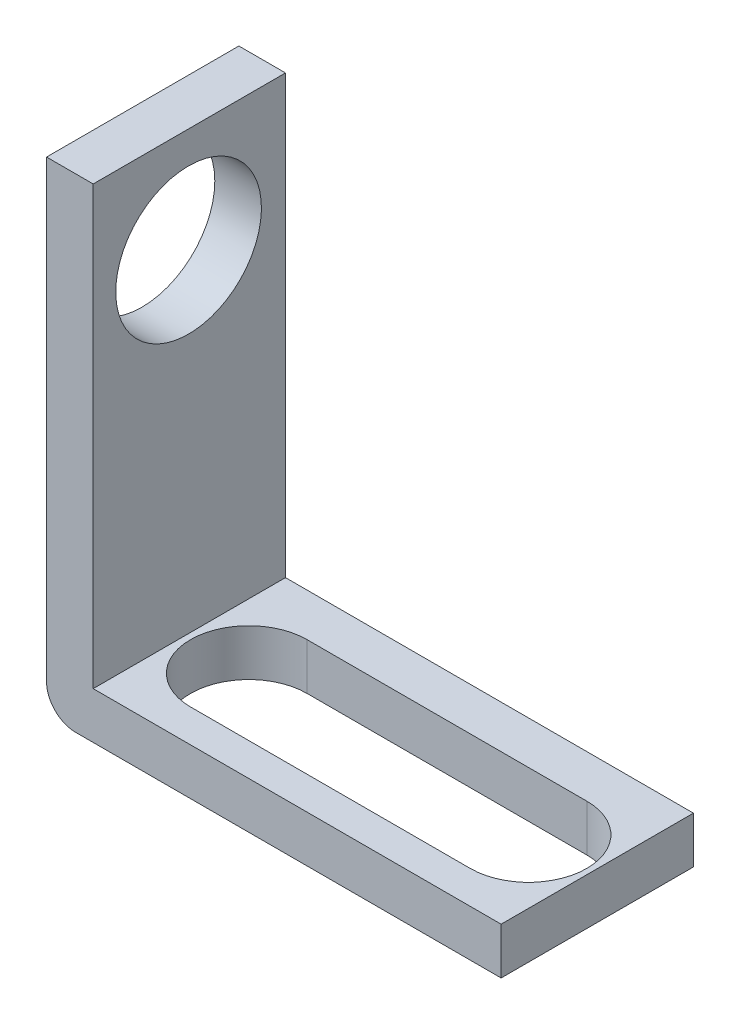
ISO-10303-21;
HEADER;
FILE_DESCRIPTION(('STEP AP214'),'2;1');
FILE_NAME('part.step','',(''),(''),'','','');
FILE_SCHEMA(('AUTOMOTIVE_DESIGN { 1 0 10303 214 1 1 1 1 }'));
ENDSEC;
DATA;
#1=APPLICATION_CONTEXT('core data for automotive mechanical design processes');
#2=APPLICATION_PROTOCOL_DEFINITION('international standard','automotive_design',2000,#1);
#3=PRODUCT_CONTEXT('',#1,'mechanical');
#4=PRODUCT('Part','Part','',(#3));
#5=PRODUCT_RELATED_PRODUCT_CATEGORY('part','',(#4));
#6=PRODUCT_DEFINITION_FORMATION('','',#4);
#7=PRODUCT_DEFINITION_CONTEXT('part definition',#1,'design');
#8=PRODUCT_DEFINITION('design','',#6,#7);
#9=PRODUCT_DEFINITION_SHAPE('','',#8);
#10=(LENGTH_UNIT() NAMED_UNIT(*) SI_UNIT(.MILLI.,.METRE.));
#11=(NAMED_UNIT(*) PLANE_ANGLE_UNIT() SI_UNIT($,.RADIAN.));
#12=(NAMED_UNIT(*) SI_UNIT($,.STERADIAN.) SOLID_ANGLE_UNIT());
#13=UNCERTAINTY_MEASURE_WITH_UNIT(LENGTH_MEASURE(1.E-05),#10,'distance_accuracy_value','');
#14=(GEOMETRIC_REPRESENTATION_CONTEXT(3) GLOBAL_UNCERTAINTY_ASSIGNED_CONTEXT((#13)) GLOBAL_UNIT_ASSIGNED_CONTEXT((#10,
#11,#12)) REPRESENTATION_CONTEXT('',''));
#15=CARTESIAN_POINT('',(0.,0.,0.));
#16=DIRECTION('',(0.,0.,1.));
#17=DIRECTION('',(1.,0.,0.));
#18=AXIS2_PLACEMENT_3D('',#15,#16,#17);
#19=CARTESIAN_POINT('',(5.,-3.,33.));
#20=DIRECTION('',(0.,0.,-1.));
#21=DIRECTION('',(-1.,0.,0.));
#22=AXIS2_PLACEMENT_3D('',#19,#20,#21);
#23=CYLINDRICAL_SURFACE('',#22,5.);
#24=CARTESIAN_POINT('',(5.,-3.,0.));
#25=DIRECTION('',(0.,0.,1.));
#26=DIRECTION('',(1.,0.,0.));
#27=AXIS2_PLACEMENT_3D('',#24,#25,#26);
#28=CIRCLE('',#27,5.);
#29=CARTESIAN_POINT('',(0.,-2.99999999999996,0.));
#30=VERTEX_POINT('',#29);
#31=CARTESIAN_POINT('',(5.00000000000004,-8.,0.));
#32=VERTEX_POINT('',#31);
#33=EDGE_CURVE('E178',#30,#32,#28,.T.);
#34=ORIENTED_EDGE('',*,*,#33,.T.);
#35=DIRECTION('',(0.,0.,-1.));
#36=VECTOR('',#35,1.);
#37=CARTESIAN_POINT('',(5.00000000000004,-8.,33.));
#38=LINE('',#37,#36);
#39=CARTESIAN_POINT('',(5.00000000000004,-8.,33.));
#40=VERTEX_POINT('',#39);
#41=EDGE_CURVE('E45',#40,#32,#38,.T.);
#42=ORIENTED_EDGE('',*,*,#41,.F.);
#43=CARTESIAN_POINT('',(5.,-3.,33.));
#44=DIRECTION('',(0.,0.,1.));
#45=DIRECTION('',(1.,0.,0.));
#46=AXIS2_PLACEMENT_3D('',#43,#44,#45);
#47=CIRCLE('',#46,5.);
#48=CARTESIAN_POINT('',(0.,-2.99999999999996,33.));
#49=VERTEX_POINT('',#48);
#50=EDGE_CURVE('E163',#49,#40,#47,.T.);
#51=ORIENTED_EDGE('',*,*,#50,.F.);
#52=DIRECTION('',(0.,0.,-1.));
#53=VECTOR('',#52,1.);
#54=CARTESIAN_POINT('',(0.,-2.99999999999996,33.));
#55=LINE('',#54,#53);
#56=EDGE_CURVE('E11',#49,#30,#55,.T.);
#57=ORIENTED_EDGE('',*,*,#56,.T.);
#58=EDGE_LOOP('',(#34,#42,#51,#57));
#59=FACE_BOUND('',#58,.T.);
#60=ADVANCED_FACE('F37',(#59),#23,.T.);
#61=CARTESIAN_POINT('',(5.00000000000004,-8.,33.));
#62=DIRECTION('',(0.,1.,0.));
#63=DIRECTION('',(0.,0.,1.));
#64=AXIS2_PLACEMENT_3D('',#61,#62,#63);
#65=PLANE('',#64);
#66=DIRECTION('',(1.,0.,0.));
#67=VECTOR('',#66,1.);
#68=CARTESIAN_POINT('',(5.00000000000004,-8.,27.366474126323));
#69=LINE('',#68,#67);
#70=CARTESIAN_POINT('',(19.0672596527845,-8.,27.366474126323));
#71=VERTEX_POINT('',#70);
#72=CARTESIAN_POINT('',(67.0672604625147,-8.,27.366474126323));
#73=VERTEX_POINT('',#72);
#74=EDGE_CURVE('E151',#71,#73,#69,.T.);
#75=ORIENTED_EDGE('',*,*,#74,.T.);
#76=CARTESIAN_POINT('',(67.0672604625147,-8.,17.366474126323));
#77=DIRECTION('',(0.,1.,0.));
#78=DIRECTION('',(0.,0.,1.));
#79=AXIS2_PLACEMENT_3D('',#76,#77,#78);
#80=CIRCLE('',#79,9.99999999999999);
#81=CARTESIAN_POINT('',(67.0672604625147,-8.,7.36647412632304));
#82=VERTEX_POINT('',#81);
#83=EDGE_CURVE('E154',#73,#82,#80,.T.);
#84=ORIENTED_EDGE('',*,*,#83,.T.);
#85=DIRECTION('',(-1.,0.,0.));
#86=VECTOR('',#85,1.);
#87=CARTESIAN_POINT('',(5.00000000000005,-8.,7.366474126323));
#88=LINE('',#87,#86);
#89=CARTESIAN_POINT('',(19.0672604625147,-8.,7.36647412632301));
#90=VERTEX_POINT('',#89);
#91=EDGE_CURVE('E146',#82,#90,#88,.T.);
#92=ORIENTED_EDGE('',*,*,#91,.T.);
#93=CARTESIAN_POINT('',(19.0672596527845,-8.,17.366474126323));
#94=DIRECTION('',(0.,1.,0.));
#95=DIRECTION('',(0.,0.,1.));
#96=AXIS2_PLACEMENT_3D('',#93,#94,#95);
#97=CIRCLE('',#96,10.);
#98=EDGE_CURVE('E126',#90,#71,#97,.T.);
#99=ORIENTED_EDGE('',*,*,#98,.T.);
#100=EDGE_LOOP('',(#75,#84,#92,#99));
#101=FACE_BOUND('',#100,.T.);
#102=DIRECTION('',(1.,0.,0.));
#103=VECTOR('',#102,1.);
#104=CARTESIAN_POINT('',(5.00000000000004,-8.,0.));
#105=LINE('',#104,#103);
#106=CARTESIAN_POINT('',(78.,-8.,0.));
#107=VERTEX_POINT('',#106);
#108=EDGE_CURVE('E180',#32,#107,#105,.T.);
#109=ORIENTED_EDGE('',*,*,#108,.T.);
#110=DIRECTION('',(0.,0.,-1.));
#111=VECTOR('',#110,1.);
#112=CARTESIAN_POINT('',(78.,-8.,33.));
#113=LINE('',#112,#111);
#114=CARTESIAN_POINT('',(78.,-8.,33.));
#115=VERTEX_POINT('',#114);
#116=EDGE_CURVE('E202',#115,#107,#113,.T.);
#117=ORIENTED_EDGE('',*,*,#116,.F.);
#118=DIRECTION('',(1.,0.,0.));
#119=VECTOR('',#118,1.);
#120=CARTESIAN_POINT('',(5.00000000000004,-8.,33.));
#121=LINE('',#120,#119);
#122=EDGE_CURVE('E166',#40,#115,#121,.T.);
#123=ORIENTED_EDGE('',*,*,#122,.F.);
#124=ORIENTED_EDGE('',*,*,#41,.T.);
#125=EDGE_LOOP('',(#109,#117,#123,#124));
#126=FACE_BOUND('',#125,.T.);
#127=ADVANCED_FACE('F210',(#101,#126),#65,.F.);
#128=CARTESIAN_POINT('',(78.,-8.,33.));
#129=DIRECTION('',(-1.,0.,0.));
#130=DIRECTION('',(0.,0.,1.));
#131=AXIS2_PLACEMENT_3D('',#128,#129,#130);
#132=PLANE('',#131);
#133=DIRECTION('',(0.,1.,0.));
#134=VECTOR('',#133,1.);
#135=CARTESIAN_POINT('',(78.,-8.,0.));
#136=LINE('',#135,#134);
#137=CARTESIAN_POINT('',(78.,0.,0.));
#138=VERTEX_POINT('',#137);
#139=EDGE_CURVE('E182',#107,#138,#136,.T.);
#140=ORIENTED_EDGE('',*,*,#139,.T.);
#141=DIRECTION('',(0.,0.,-1.));
#142=VECTOR('',#141,1.);
#143=CARTESIAN_POINT('',(78.,0.,33.));
#144=LINE('',#143,#142);
#145=CARTESIAN_POINT('',(78.,0.,33.));
#146=VERTEX_POINT('',#145);
#147=EDGE_CURVE('E199',#146,#138,#144,.T.);
#148=ORIENTED_EDGE('',*,*,#147,.F.);
#149=DIRECTION('',(0.,1.,0.));
#150=VECTOR('',#149,1.);
#151=CARTESIAN_POINT('',(78.,-8.,33.));
#152=LINE('',#151,#150);
#153=EDGE_CURVE('E168',#115,#146,#152,.T.);
#154=ORIENTED_EDGE('',*,*,#153,.F.);
#155=ORIENTED_EDGE('',*,*,#116,.T.);
#156=EDGE_LOOP('',(#140,#148,#154,#155));
#157=FACE_BOUND('',#156,.T.);
#158=ADVANCED_FACE('F222',(#157),#132,.F.);
#159=CARTESIAN_POINT('',(78.,0.,33.));
#160=DIRECTION('',(0.,-1.,0.));
#161=DIRECTION('',(1.,0.,0.));
#162=AXIS2_PLACEMENT_3D('',#159,#160,#161);
#163=PLANE('',#162);
#164=DIRECTION('',(-1.,0.,0.));
#165=VECTOR('',#164,1.);
#166=CARTESIAN_POINT('',(19.0672604625147,0.,7.36647412632301));
#167=LINE('',#166,#165);
#168=CARTESIAN_POINT('',(67.0672604625147,0.,7.36647412632304));
#169=VERTEX_POINT('',#168);
#170=CARTESIAN_POINT('',(19.0672604625147,0.,7.36647412632302));
#171=VERTEX_POINT('',#170);
#172=EDGE_CURVE('E132',#169,#171,#167,.T.);
#173=ORIENTED_EDGE('',*,*,#172,.F.);
#174=CARTESIAN_POINT('',(67.0672604625147,0.,17.366474126323));
#175=DIRECTION('',(0.,1.,0.));
#176=DIRECTION('',(-1.,0.,0.));
#177=AXIS2_PLACEMENT_3D('',#174,#175,#176);
#178=CIRCLE('',#177,9.99999999999999);
#179=CARTESIAN_POINT('',(67.0672604625147,0.,27.366474126323));
#180=VERTEX_POINT('',#179);
#181=EDGE_CURVE('E60',#180,#169,#178,.T.);
#182=ORIENTED_EDGE('',*,*,#181,.F.);
#183=DIRECTION('',(1.,0.,0.));
#184=VECTOR('',#183,1.);
#185=CARTESIAN_POINT('',(19.0672596527845,0.,27.366474126323));
#186=LINE('',#185,#184);
#187=CARTESIAN_POINT('',(19.0672596527845,0.,27.366474126323));
#188=VERTEX_POINT('',#187);
#189=EDGE_CURVE('E139',#188,#180,#186,.T.);
#190=ORIENTED_EDGE('',*,*,#189,.F.);
#191=CARTESIAN_POINT('',(19.0672596527845,0.,17.366474126323));
#192=DIRECTION('',(0.,1.,0.));
#193=DIRECTION('',(-1.,0.,0.));
#194=AXIS2_PLACEMENT_3D('',#191,#192,#193);
#195=CIRCLE('',#194,10.);
#196=EDGE_CURVE('E123',#171,#188,#195,.T.);
#197=ORIENTED_EDGE('',*,*,#196,.F.);
#198=EDGE_LOOP('',(#173,#182,#190,#197));
#199=FACE_BOUND('',#198,.T.);
#200=DIRECTION('',(-1.,0.,0.));
#201=VECTOR('',#200,1.);
#202=CARTESIAN_POINT('',(78.,0.,0.));
#203=LINE('',#202,#201);
#204=CARTESIAN_POINT('',(8.00000000000001,0.,0.));
#205=VERTEX_POINT('',#204);
#206=EDGE_CURVE('E184',#138,#205,#203,.T.);
#207=ORIENTED_EDGE('',*,*,#206,.T.);
#208=DIRECTION('',(0.,0.,-1.));
#209=VECTOR('',#208,1.);
#210=CARTESIAN_POINT('',(8.00000000000001,0.,33.));
#211=LINE('',#210,#209);
#212=CARTESIAN_POINT('',(8.00000000000001,0.,33.));
#213=VERTEX_POINT('',#212);
#214=EDGE_CURVE('E196',#213,#205,#211,.T.);
#215=ORIENTED_EDGE('',*,*,#214,.F.);
#216=DIRECTION('',(-1.,0.,0.));
#217=VECTOR('',#216,1.);
#218=CARTESIAN_POINT('',(78.,0.,33.));
#219=LINE('',#218,#217);
#220=EDGE_CURVE('E170',#146,#213,#219,.T.);
#221=ORIENTED_EDGE('',*,*,#220,.F.);
#222=ORIENTED_EDGE('',*,*,#147,.T.);
#223=EDGE_LOOP('',(#207,#215,#221,#222));
#224=FACE_BOUND('',#223,.T.);
#225=ADVANCED_FACE('F136',(#199,#224),#163,.F.);
#226=CARTESIAN_POINT('',(8.,75.,33.));
#227=DIRECTION('',(-1.,0.,0.));
#228=DIRECTION('',(0.,-1.,0.));
#229=AXIS2_PLACEMENT_3D('',#226,#227,#228);
#230=PLANE('',#229);
#231=CARTESIAN_POINT('',(8.,57.,16.6296948184175));
#232=DIRECTION('',(1.,0.,0.));
#233=DIRECTION('',(0.,1.,0.));
#234=AXIS2_PLACEMENT_3D('',#231,#232,#233);
#235=CIRCLE('',#234,12.5);
#236=CARTESIAN_POINT('',(8.,69.5,16.6296948184175));
#237=VERTEX_POINT('',#236);
#238=EDGE_CURVE('E157',#237,#237,#235,.T.);
#239=ORIENTED_EDGE('',*,*,#238,.F.);
#240=EDGE_LOOP('',(#239));
#241=FACE_BOUND('',#240,.T.);
#242=DIRECTION('',(0.,1.,0.));
#243=VECTOR('',#242,1.);
#244=CARTESIAN_POINT('',(8.,75.,0.));
#245=LINE('',#244,#243);
#246=CARTESIAN_POINT('',(8.,75.,0.));
#247=VERTEX_POINT('',#246);
#248=EDGE_CURVE('E186',#205,#247,#245,.T.);
#249=ORIENTED_EDGE('',*,*,#248,.T.);
#250=DIRECTION('',(0.,0.,-1.));
#251=VECTOR('',#250,1.);
#252=CARTESIAN_POINT('',(8.,75.,33.));
#253=LINE('',#252,#251);
#254=CARTESIAN_POINT('',(8.,75.,33.));
#255=VERTEX_POINT('',#254);
#256=EDGE_CURVE('E193',#255,#247,#253,.T.);
#257=ORIENTED_EDGE('',*,*,#256,.F.);
#258=DIRECTION('',(0.,1.,0.));
#259=VECTOR('',#258,1.);
#260=CARTESIAN_POINT('',(8.,75.,33.));
#261=LINE('',#260,#259);
#262=EDGE_CURVE('E172',#213,#255,#261,.T.);
#263=ORIENTED_EDGE('',*,*,#262,.F.);
#264=ORIENTED_EDGE('',*,*,#214,.T.);
#265=EDGE_LOOP('',(#249,#257,#263,#264));
#266=FACE_BOUND('',#265,.T.);
#267=ADVANCED_FACE('F239',(#241,#266),#230,.F.);
#268=CARTESIAN_POINT('',(0.,75.,33.));
#269=DIRECTION('',(0.,-1.,0.));
#270=DIRECTION('',(0.,0.,-1.));
#271=AXIS2_PLACEMENT_3D('',#268,#269,#270);
#272=PLANE('',#271);
#273=DIRECTION('',(-1.,0.,0.));
#274=VECTOR('',#273,1.);
#275=CARTESIAN_POINT('',(0.,75.,0.));
#276=LINE('',#275,#274);
#277=CARTESIAN_POINT('',(0.,75.,0.));
#278=VERTEX_POINT('',#277);
#279=EDGE_CURVE('E188',#247,#278,#276,.T.);
#280=ORIENTED_EDGE('',*,*,#279,.T.);
#281=DIRECTION('',(0.,0.,-1.));
#282=VECTOR('',#281,1.);
#283=CARTESIAN_POINT('',(0.,75.,33.));
#284=LINE('',#283,#282);
#285=CARTESIAN_POINT('',(0.,75.,33.));
#286=VERTEX_POINT('',#285);
#287=EDGE_CURVE('E177',#286,#278,#284,.T.);
#288=ORIENTED_EDGE('',*,*,#287,.F.);
#289=DIRECTION('',(-1.,0.,0.));
#290=VECTOR('',#289,1.);
#291=CARTESIAN_POINT('',(0.,75.,33.));
#292=LINE('',#291,#290);
#293=EDGE_CURVE('E174',#255,#286,#292,.T.);
#294=ORIENTED_EDGE('',*,*,#293,.F.);
#295=ORIENTED_EDGE('',*,*,#256,.T.);
#296=EDGE_LOOP('',(#280,#288,#294,#295));
#297=FACE_BOUND('',#296,.T.);
#298=ADVANCED_FACE('F236',(#297),#272,.F.);
#299=CARTESIAN_POINT('',(0.,0.,33.));
#300=DIRECTION('',(1.,0.,0.));
#301=DIRECTION('',(0.,0.,-1.));
#302=AXIS2_PLACEMENT_3D('',#299,#300,#301);
#303=PLANE('',#302);
#304=CARTESIAN_POINT('',(0.,57.,16.6296948184175));
#305=DIRECTION('',(1.,0.,0.));
#306=DIRECTION('',(0.,0.,-1.));
#307=AXIS2_PLACEMENT_3D('',#304,#305,#306);
#308=CIRCLE('',#307,12.5);
#309=CARTESIAN_POINT('',(0.,57.,4.12969481841745));
#310=VERTEX_POINT('',#309);
#311=EDGE_CURVE('E40',#310,#310,#308,.T.);
#312=ORIENTED_EDGE('',*,*,#311,.T.);
#313=EDGE_LOOP('',(#312));
#314=FACE_BOUND('',#313,.T.);
#315=DIRECTION('',(0.,-1.,0.));
#316=VECTOR('',#315,1.);
#317=CARTESIAN_POINT('',(0.,0.,0.));
#318=LINE('',#317,#316);
#319=EDGE_CURVE('E164',#278,#30,#318,.T.);
#320=ORIENTED_EDGE('',*,*,#319,.T.);
#321=ORIENTED_EDGE('',*,*,#56,.F.);
#322=DIRECTION('',(0.,-1.,0.));
#323=VECTOR('',#322,1.);
#324=CARTESIAN_POINT('',(0.,0.,33.));
#325=LINE('',#324,#323);
#326=EDGE_CURVE('E160',#286,#49,#325,.T.);
#327=ORIENTED_EDGE('',*,*,#326,.F.);
#328=ORIENTED_EDGE('',*,*,#287,.T.);
#329=EDGE_LOOP('',(#320,#321,#327,#328));
#330=FACE_BOUND('',#329,.T.);
#331=ADVANCED_FACE('F232',(#314,#330),#303,.F.);
#332=CARTESIAN_POINT('',(5.,-3.,33.));
#333=DIRECTION('',(0.,0.,1.));
#334=DIRECTION('',(1.,0.,0.));
#335=AXIS2_PLACEMENT_3D('',#332,#333,#334);
#336=PLANE('',#335);
#337=ORIENTED_EDGE('',*,*,#326,.T.);
#338=ORIENTED_EDGE('',*,*,#50,.T.);
#339=ORIENTED_EDGE('',*,*,#122,.T.);
#340=ORIENTED_EDGE('',*,*,#153,.T.);
#341=ORIENTED_EDGE('',*,*,#220,.T.);
#342=ORIENTED_EDGE('',*,*,#262,.T.);
#343=ORIENTED_EDGE('',*,*,#293,.T.);
#344=EDGE_LOOP('',(#337,#338,#339,#340,#341,#342,#343));
#345=FACE_BOUND('',#344,.T.);
#346=ADVANCED_FACE('F228',(#345),#336,.T.);
#347=CARTESIAN_POINT('',(5.,-3.,0.));
#348=DIRECTION('',(0.,0.,1.));
#349=DIRECTION('',(1.,0.,0.));
#350=AXIS2_PLACEMENT_3D('',#347,#348,#349);
#351=PLANE('',#350);
#352=ORIENTED_EDGE('',*,*,#33,.F.);
#353=ORIENTED_EDGE('',*,*,#319,.F.);
#354=ORIENTED_EDGE('',*,*,#279,.F.);
#355=ORIENTED_EDGE('',*,*,#248,.F.);
#356=ORIENTED_EDGE('',*,*,#206,.F.);
#357=ORIENTED_EDGE('',*,*,#139,.F.);
#358=ORIENTED_EDGE('',*,*,#108,.F.);
#359=EDGE_LOOP('',(#352,#353,#354,#355,#356,#357,#358));
#360=FACE_BOUND('',#359,.T.);
#361=ADVANCED_FACE('F216',(#360),#351,.F.);
#362=CARTESIAN_POINT('',(-25.,57.,16.6296948184175));
#363=DIRECTION('',(1.,0.,0.));
#364=DIRECTION('',(0.,1.,0.));
#365=AXIS2_PLACEMENT_3D('',#362,#363,#364);
#366=CYLINDRICAL_SURFACE('',#365,12.5);
#367=ORIENTED_EDGE('',*,*,#238,.T.);
#368=EDGE_LOOP('',(#367));
#369=FACE_BOUND('',#368,.T.);
#370=ORIENTED_EDGE('',*,*,#311,.F.);
#371=EDGE_LOOP('',(#370));
#372=FACE_BOUND('',#371,.T.);
#373=ADVANCED_FACE('F264',(#369,#372),#366,.F.);
#374=CARTESIAN_POINT('',(67.0672604625147,-33.,17.366474126323));
#375=DIRECTION('',(0.,1.,0.));
#376=DIRECTION('',(-1.,0.,0.));
#377=AXIS2_PLACEMENT_3D('',#374,#375,#376);
#378=CYLINDRICAL_SURFACE('',#377,9.99999999999999);
#379=DIRECTION('',(0.,1.,0.));
#380=VECTOR('',#379,1.);
#381=CARTESIAN_POINT('',(67.0672604625147,-33.,27.366474126323));
#382=LINE('',#381,#380);
#383=EDGE_CURVE('E144',#73,#180,#382,.T.);
#384=ORIENTED_EDGE('',*,*,#383,.T.);
#385=ORIENTED_EDGE('',*,*,#181,.T.);
#386=DIRECTION('',(0.,1.,0.));
#387=VECTOR('',#386,1.);
#388=CARTESIAN_POINT('',(67.0672604625147,-33.,7.36647412632304));
#389=LINE('',#388,#387);
#390=EDGE_CURVE('E129',#82,#169,#389,.T.);
#391=ORIENTED_EDGE('',*,*,#390,.F.);
#392=ORIENTED_EDGE('',*,*,#83,.F.);
#393=EDGE_LOOP('',(#384,#385,#391,#392));
#394=FACE_BOUND('',#393,.T.);
#395=ADVANCED_FACE('F262',(#394),#378,.F.);
#396=CARTESIAN_POINT('',(19.0672596527845,-33.,27.366474126323));
#397=DIRECTION('',(0.,0.,1.));
#398=DIRECTION('',(1.,0.,0.));
#399=AXIS2_PLACEMENT_3D('',#396,#397,#398);
#400=PLANE('',#399);
#401=DIRECTION('',(0.,1.,0.));
#402=VECTOR('',#401,1.);
#403=CARTESIAN_POINT('',(19.0672596527845,-33.,27.366474126323));
#404=LINE('',#403,#402);
#405=EDGE_CURVE('E128',#71,#188,#404,.T.);
#406=ORIENTED_EDGE('',*,*,#405,.T.);
#407=ORIENTED_EDGE('',*,*,#189,.T.);
#408=ORIENTED_EDGE('',*,*,#383,.F.);
#409=ORIENTED_EDGE('',*,*,#74,.F.);
#410=EDGE_LOOP('',(#406,#407,#408,#409));
#411=FACE_BOUND('',#410,.T.);
#412=ADVANCED_FACE('F261',(#411),#400,.F.);
#413=CARTESIAN_POINT('',(19.0672596527845,-33.,17.366474126323));
#414=DIRECTION('',(0.,1.,0.));
#415=DIRECTION('',(-1.,0.,0.));
#416=AXIS2_PLACEMENT_3D('',#413,#414,#415);
#417=CYLINDRICAL_SURFACE('',#416,10.);
#418=DIRECTION('',(0.,1.,0.));
#419=VECTOR('',#418,1.);
#420=CARTESIAN_POINT('',(19.0672604625147,-33.,7.36647412632302));
#421=LINE('',#420,#419);
#422=EDGE_CURVE('E52',#90,#171,#421,.T.);
#423=ORIENTED_EDGE('',*,*,#422,.T.);
#424=ORIENTED_EDGE('',*,*,#196,.T.);
#425=ORIENTED_EDGE('',*,*,#405,.F.);
#426=ORIENTED_EDGE('',*,*,#98,.F.);
#427=EDGE_LOOP('',(#423,#424,#425,#426));
#428=FACE_BOUND('',#427,.T.);
#429=ADVANCED_FACE('F120',(#428),#417,.F.);
#430=CARTESIAN_POINT('',(19.0672604625147,-33.,7.36647412632301));
#431=DIRECTION('',(0.,0.,-1.));
#432=DIRECTION('',(-1.,0.,0.));
#433=AXIS2_PLACEMENT_3D('',#430,#431,#432);
#434=PLANE('',#433);
#435=ORIENTED_EDGE('',*,*,#390,.T.);
#436=ORIENTED_EDGE('',*,*,#172,.T.);
#437=ORIENTED_EDGE('',*,*,#422,.F.);
#438=ORIENTED_EDGE('',*,*,#91,.F.);
#439=EDGE_LOOP('',(#435,#436,#437,#438));
#440=FACE_BOUND('',#439,.T.);
#441=ADVANCED_FACE('F133',(#440),#434,.F.);
#442=CLOSED_SHELL('',(#60,#127,#158,#225,#267,#298,#331,#346,#361,#373,#395,#412,#429,#441));
#443=MANIFOLD_SOLID_BREP('B2',#442);
#444=ADVANCED_BREP_SHAPE_REPRESENTATION('',(#18,#443),#14);
#445=SHAPE_DEFINITION_REPRESENTATION(#9,#444);
ENDSEC;
END-ISO-10303-21;
